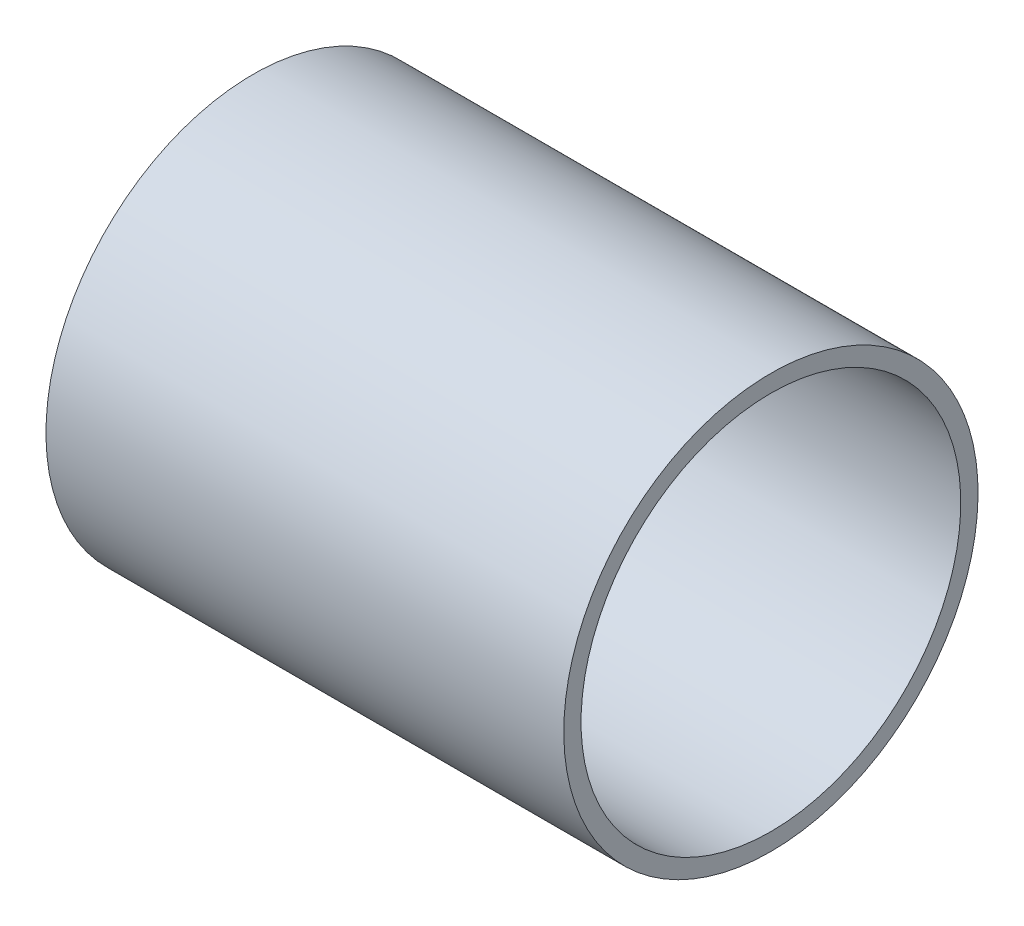
ISO-10303-21;
HEADER;
FILE_DESCRIPTION(('STEP AP214'),'2;1');
FILE_NAME('part.step','',(''),(''),'','','');
FILE_SCHEMA(('AUTOMOTIVE_DESIGN { 1 0 10303 214 1 1 1 1 }'));
ENDSEC;
DATA;
#1=APPLICATION_CONTEXT('core data for automotive mechanical design processes');
#2=APPLICATION_PROTOCOL_DEFINITION('international standard','automotive_design',2000,#1);
#3=PRODUCT_CONTEXT('',#1,'mechanical');
#4=PRODUCT('Part','Part','',(#3));
#5=PRODUCT_RELATED_PRODUCT_CATEGORY('part','',(#4));
#6=PRODUCT_DEFINITION_FORMATION('','',#4);
#7=PRODUCT_DEFINITION_CONTEXT('part definition',#1,'design');
#8=PRODUCT_DEFINITION('design','',#6,#7);
#9=PRODUCT_DEFINITION_SHAPE('','',#8);
#10=(LENGTH_UNIT() NAMED_UNIT(*) SI_UNIT(.MILLI.,.METRE.));
#11=(NAMED_UNIT(*) PLANE_ANGLE_UNIT() SI_UNIT($,.RADIAN.));
#12=(NAMED_UNIT(*) SI_UNIT($,.STERADIAN.) SOLID_ANGLE_UNIT());
#13=UNCERTAINTY_MEASURE_WITH_UNIT(LENGTH_MEASURE(1.E-05),#10,'distance_accuracy_value','');
#14=(GEOMETRIC_REPRESENTATION_CONTEXT(3) GLOBAL_UNCERTAINTY_ASSIGNED_CONTEXT((#13)) GLOBAL_UNIT_ASSIGNED_CONTEXT((#10,
#11,#12)) REPRESENTATION_CONTEXT('',''));
#15=CARTESIAN_POINT('',(0.,0.,0.));
#16=DIRECTION('',(0.,0.,1.));
#17=DIRECTION('',(1.,0.,0.));
#18=AXIS2_PLACEMENT_3D('',#15,#16,#17);
#19=CARTESIAN_POINT('',(-15.,12.,0.));
#20=DIRECTION('',(1.,0.,0.));
#21=DIRECTION('',(0.,1.,0.));
#22=AXIS2_PLACEMENT_3D('',#19,#20,#21);
#23=PLANE('',#22);
#24=CARTESIAN_POINT('',(-15.,0.,0.));
#25=DIRECTION('',(-1.,0.,0.));
#26=DIRECTION('',(0.,-1.,0.));
#27=AXIS2_PLACEMENT_3D('',#24,#25,#26);
#28=CIRCLE('',#27,11.);
#29=CARTESIAN_POINT('',(-15.,-11.,0.));
#30=VERTEX_POINT('',#29);
#31=EDGE_CURVE('E10',#30,#30,#28,.T.);
#32=ORIENTED_EDGE('',*,*,#31,.F.);
#33=EDGE_LOOP('',(#32));
#34=FACE_BOUND('',#33,.T.);
#35=CARTESIAN_POINT('',(-15.,0.,0.));
#36=DIRECTION('',(-1.,0.,0.));
#37=DIRECTION('',(0.,-1.,0.));
#38=AXIS2_PLACEMENT_3D('',#35,#36,#37);
#39=CIRCLE('',#38,12.);
#40=CARTESIAN_POINT('',(-15.,-12.,0.));
#41=VERTEX_POINT('',#40);
#42=EDGE_CURVE('E45',#41,#41,#39,.T.);
#43=ORIENTED_EDGE('',*,*,#42,.T.);
#44=EDGE_LOOP('',(#43));
#45=FACE_BOUND('',#44,.T.);
#46=ADVANCED_FACE('F31',(#34,#45),#23,.F.);
#47=CARTESIAN_POINT('',(-66.5774744027304,0.,0.));
#48=DIRECTION('',(-1.,0.,0.));
#49=DIRECTION('',(0.,-1.,0.));
#50=AXIS2_PLACEMENT_3D('',#47,#48,#49);
#51=CYLINDRICAL_SURFACE('',#50,11.);
#52=CARTESIAN_POINT('',(15.,0.,0.));
#53=DIRECTION('',(-1.,0.,0.));
#54=DIRECTION('',(0.,-1.,0.));
#55=AXIS2_PLACEMENT_3D('',#52,#53,#54);
#56=CIRCLE('',#55,11.);
#57=CARTESIAN_POINT('',(15.,-11.,0.));
#58=VERTEX_POINT('',#57);
#59=EDGE_CURVE('E37',#58,#58,#56,.T.);
#60=ORIENTED_EDGE('',*,*,#59,.F.);
#61=EDGE_LOOP('',(#60));
#62=FACE_BOUND('',#61,.T.);
#63=ORIENTED_EDGE('',*,*,#31,.T.);
#64=EDGE_LOOP('',(#63));
#65=FACE_BOUND('',#64,.T.);
#66=ADVANCED_FACE('F60',(#62,#65),#51,.F.);
#67=CARTESIAN_POINT('',(15.,11.,0.));
#68=DIRECTION('',(-1.,0.,0.));
#69=DIRECTION('',(0.,-1.,0.));
#70=AXIS2_PLACEMENT_3D('',#67,#68,#69);
#71=PLANE('',#70);
#72=CARTESIAN_POINT('',(15.,0.,0.));
#73=DIRECTION('',(-1.,0.,0.));
#74=DIRECTION('',(0.,-1.,0.));
#75=AXIS2_PLACEMENT_3D('',#72,#73,#74);
#76=CIRCLE('',#75,12.);
#77=CARTESIAN_POINT('',(15.,-12.,0.));
#78=VERTEX_POINT('',#77);
#79=EDGE_CURVE('E41',#78,#78,#76,.T.);
#80=ORIENTED_EDGE('',*,*,#79,.F.);
#81=EDGE_LOOP('',(#80));
#82=FACE_BOUND('',#81,.T.);
#83=ORIENTED_EDGE('',*,*,#59,.T.);
#84=EDGE_LOOP('',(#83));
#85=FACE_BOUND('',#84,.T.);
#86=ADVANCED_FACE('F55',(#82,#85),#71,.F.);
#87=CARTESIAN_POINT('',(-66.5774744027304,0.,0.));
#88=DIRECTION('',(-1.,0.,0.));
#89=DIRECTION('',(0.,-1.,0.));
#90=AXIS2_PLACEMENT_3D('',#87,#88,#89);
#91=CYLINDRICAL_SURFACE('',#90,12.);
#92=ORIENTED_EDGE('',*,*,#42,.F.);
#93=EDGE_LOOP('',(#92));
#94=FACE_BOUND('',#93,.T.);
#95=ORIENTED_EDGE('',*,*,#79,.T.);
#96=EDGE_LOOP('',(#95));
#97=FACE_BOUND('',#96,.T.);
#98=ADVANCED_FACE('F52',(#94,#97),#91,.T.);
#99=CLOSED_SHELL('',(#46,#66,#86,#98));
#100=MANIFOLD_SOLID_BREP('B2',#99);
#101=ADVANCED_BREP_SHAPE_REPRESENTATION('',(#18,#100),#14);
#102=SHAPE_DEFINITION_REPRESENTATION(#9,#101);
ENDSEC;
END-ISO-10303-21;
